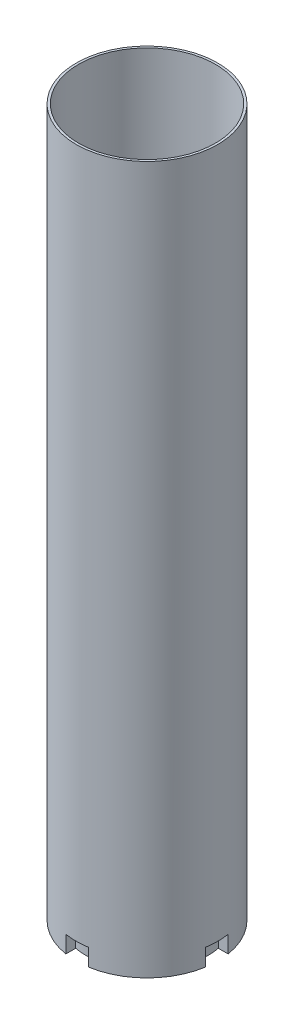
ISO-10303-21;
HEADER;
FILE_DESCRIPTION(('STEP AP214'),'2;1');
FILE_NAME('part.step','',(''),(''),'','','');
FILE_SCHEMA(('AUTOMOTIVE_DESIGN { 1 0 10303 214 1 1 1 1 }'));
ENDSEC;
DATA;
#1=APPLICATION_CONTEXT('core data for automotive mechanical design processes');
#2=APPLICATION_PROTOCOL_DEFINITION('international standard','automotive_design',2000,#1);
#3=PRODUCT_CONTEXT('',#1,'mechanical');
#4=PRODUCT('Part','Part','',(#3));
#5=PRODUCT_RELATED_PRODUCT_CATEGORY('part','',(#4));
#6=PRODUCT_DEFINITION_FORMATION('','',#4);
#7=PRODUCT_DEFINITION_CONTEXT('part definition',#1,'design');
#8=PRODUCT_DEFINITION('design','',#6,#7);
#9=PRODUCT_DEFINITION_SHAPE('','',#8);
#10=(LENGTH_UNIT() NAMED_UNIT(*) SI_UNIT(.MILLI.,.METRE.));
#11=(NAMED_UNIT(*) PLANE_ANGLE_UNIT() SI_UNIT($,.RADIAN.));
#12=(NAMED_UNIT(*) SI_UNIT($,.STERADIAN.) SOLID_ANGLE_UNIT());
#13=UNCERTAINTY_MEASURE_WITH_UNIT(LENGTH_MEASURE(1.E-05),#10,'distance_accuracy_value','');
#14=(GEOMETRIC_REPRESENTATION_CONTEXT(3) GLOBAL_UNCERTAINTY_ASSIGNED_CONTEXT((#13)) GLOBAL_UNIT_ASSIGNED_CONTEXT((#10,
#11,#12)) REPRESENTATION_CONTEXT('',''));
#15=CARTESIAN_POINT('',(0.,0.,0.));
#16=DIRECTION('',(0.,0.,1.));
#17=DIRECTION('',(1.,0.,0.));
#18=AXIS2_PLACEMENT_3D('',#15,#16,#17);
#19=CARTESIAN_POINT('',(0.,310.,0.));
#20=DIRECTION('',(0.,-1.,0.));
#21=DIRECTION('',(0.,0.,-1.));
#22=AXIS2_PLACEMENT_3D('',#19,#20,#21);
#23=CYLINDRICAL_SURFACE('',#22,31.);
#24=CARTESIAN_POINT('',(0.,310.,0.));
#25=DIRECTION('',(0.,1.,0.));
#26=DIRECTION('',(0.,0.,1.));
#27=AXIS2_PLACEMENT_3D('',#24,#25,#26);
#28=CIRCLE('',#27,31.);
#29=CARTESIAN_POINT('',(0.,310.,31.));
#30=VERTEX_POINT('',#29);
#31=EDGE_CURVE('E11',#30,#30,#28,.T.);
#32=ORIENTED_EDGE('',*,*,#31,.F.);
#33=EDGE_LOOP('',(#32));
#34=FACE_BOUND('',#33,.T.);
#35=CARTESIAN_POINT('',(0.,7.5,0.));
#36=DIRECTION('',(0.,-1.,0.));
#37=DIRECTION('',(0.,0.,-1.));
#38=AXIS2_PLACEMENT_3D('',#35,#36,#37);
#39=CIRCLE('',#38,31.);
#40=CARTESIAN_POINT('',(-5.,7.5,-30.5941170815567));
#41=VERTEX_POINT('',#40);
#42=CARTESIAN_POINT('',(5.,7.5,-30.5941170815567));
#43=VERTEX_POINT('',#42);
#44=EDGE_CURVE('E165',#41,#43,#39,.T.);
#45=ORIENTED_EDGE('',*,*,#44,.F.);
#46=DIRECTION('',(0.,-1.,0.));
#47=VECTOR('',#46,1.);
#48=CARTESIAN_POINT('',(-5.,7.5,-30.5941170815567));
#49=LINE('',#48,#47);
#50=CARTESIAN_POINT('',(-5.,0.,-30.5941170815567));
#51=VERTEX_POINT('',#50);
#52=EDGE_CURVE('E314',#41,#51,#49,.T.);
#53=ORIENTED_EDGE('',*,*,#52,.T.);
#54=CARTESIAN_POINT('',(0.,0.,0.));
#55=DIRECTION('',(0.,1.,0.));
#56=DIRECTION('',(0.,0.,1.));
#57=AXIS2_PLACEMENT_3D('',#54,#55,#56);
#58=CIRCLE('',#57,31.);
#59=CARTESIAN_POINT('',(-30.5941170815567,0.,-4.99999999999989));
#60=VERTEX_POINT('',#59);
#61=EDGE_CURVE('E339',#51,#60,#58,.T.);
#62=ORIENTED_EDGE('',*,*,#61,.T.);
#63=DIRECTION('',(0.,-1.,0.));
#64=VECTOR('',#63,1.);
#65=CARTESIAN_POINT('',(-30.5941170815567,7.5,-4.99999999999989));
#66=LINE('',#65,#64);
#67=CARTESIAN_POINT('',(-30.5941170815567,7.5,-4.99999999999989));
#68=VERTEX_POINT('',#67);
#69=EDGE_CURVE('E61',#68,#60,#66,.T.);
#70=ORIENTED_EDGE('',*,*,#69,.F.);
#71=CARTESIAN_POINT('',(0.,7.5,0.));
#72=DIRECTION('',(0.,-1.,0.));
#73=DIRECTION('',(0.,0.,-1.));
#74=AXIS2_PLACEMENT_3D('',#71,#72,#73);
#75=CIRCLE('',#74,31.);
#76=CARTESIAN_POINT('',(-30.5941170815567,7.5,5.00000000000011));
#77=VERTEX_POINT('',#76);
#78=EDGE_CURVE('E190',#77,#68,#75,.T.);
#79=ORIENTED_EDGE('',*,*,#78,.F.);
#80=DIRECTION('',(0.,-1.,0.));
#81=VECTOR('',#80,1.);
#82=CARTESIAN_POINT('',(-30.5941170815567,7.5,5.00000000000011));
#83=LINE('',#82,#81);
#84=CARTESIAN_POINT('',(-30.5941170815567,0.,5.00000000000011));
#85=VERTEX_POINT('',#84);
#86=EDGE_CURVE('E217',#77,#85,#83,.T.);
#87=ORIENTED_EDGE('',*,*,#86,.T.);
#88=CARTESIAN_POINT('',(-4.99999999999979,0.,30.5941170815567));
#89=VERTEX_POINT('',#88);
#90=EDGE_CURVE('E310',#85,#89,#58,.T.);
#91=ORIENTED_EDGE('',*,*,#90,.T.);
#92=DIRECTION('',(0.,-1.,0.));
#93=VECTOR('',#92,1.);
#94=CARTESIAN_POINT('',(-4.99999999999979,7.5,30.5941170815567));
#95=LINE('',#94,#93);
#96=CARTESIAN_POINT('',(-4.99999999999979,7.5,30.5941170815567));
#97=VERTEX_POINT('',#96);
#98=EDGE_CURVE('E53',#97,#89,#95,.T.);
#99=ORIENTED_EDGE('',*,*,#98,.F.);
#100=CARTESIAN_POINT('',(0.,7.5,0.));
#101=DIRECTION('',(0.,-1.,0.));
#102=DIRECTION('',(0.,0.,-1.));
#103=AXIS2_PLACEMENT_3D('',#100,#101,#102);
#104=CIRCLE('',#103,31.);
#105=CARTESIAN_POINT('',(5.00000000000021,7.5,30.5941170815567));
#106=VERTEX_POINT('',#105);
#107=EDGE_CURVE('E230',#106,#97,#104,.T.);
#108=ORIENTED_EDGE('',*,*,#107,.F.);
#109=DIRECTION('',(0.,-1.,0.));
#110=VECTOR('',#109,1.);
#111=CARTESIAN_POINT('',(5.00000000000021,7.5,30.5941170815567));
#112=LINE('',#111,#110);
#113=CARTESIAN_POINT('',(5.00000000000021,0.,30.5941170815567));
#114=VERTEX_POINT('',#113);
#115=EDGE_CURVE('E211',#106,#114,#112,.T.);
#116=ORIENTED_EDGE('',*,*,#115,.T.);
#117=CARTESIAN_POINT('',(30.5941170815568,0.,4.99999999999968));
#118=VERTEX_POINT('',#117);
#119=EDGE_CURVE('E41',#114,#118,#58,.T.);
#120=ORIENTED_EDGE('',*,*,#119,.T.);
#121=DIRECTION('',(0.,-1.,0.));
#122=VECTOR('',#121,1.);
#123=CARTESIAN_POINT('',(30.5941170815568,7.5,4.99999999999968));
#124=LINE('',#123,#122);
#125=CARTESIAN_POINT('',(30.5941170815568,7.5,4.99999999999968));
#126=VERTEX_POINT('',#125);
#127=EDGE_CURVE('E285',#126,#118,#124,.T.);
#128=ORIENTED_EDGE('',*,*,#127,.F.);
#129=CARTESIAN_POINT('',(0.,7.5,0.));
#130=DIRECTION('',(0.,-1.,0.));
#131=DIRECTION('',(0.,0.,-1.));
#132=AXIS2_PLACEMENT_3D('',#129,#130,#131);
#133=CIRCLE('',#132,31.);
#134=CARTESIAN_POINT('',(30.5941170815567,7.5,-5.00000000000032));
#135=VERTEX_POINT('',#134);
#136=EDGE_CURVE('E268',#135,#126,#133,.T.);
#137=ORIENTED_EDGE('',*,*,#136,.F.);
#138=DIRECTION('',(0.,-1.,0.));
#139=VECTOR('',#138,1.);
#140=CARTESIAN_POINT('',(30.5941170815567,7.5,-5.00000000000032));
#141=LINE('',#140,#139);
#142=CARTESIAN_POINT('',(30.5941170815567,0.,-5.00000000000032));
#143=VERTEX_POINT('',#142);
#144=EDGE_CURVE('E251',#135,#143,#141,.T.);
#145=ORIENTED_EDGE('',*,*,#144,.T.);
#146=CARTESIAN_POINT('',(5.,0.,-30.5941170815567));
#147=VERTEX_POINT('',#146);
#148=EDGE_CURVE('E180',#143,#147,#58,.T.);
#149=ORIENTED_EDGE('',*,*,#148,.T.);
#150=DIRECTION('',(0.,-1.,0.));
#151=VECTOR('',#150,1.);
#152=CARTESIAN_POINT('',(5.,7.5,-30.5941170815567));
#153=LINE('',#152,#151);
#154=EDGE_CURVE('E157',#43,#147,#153,.T.);
#155=ORIENTED_EDGE('',*,*,#154,.F.);
#156=EDGE_LOOP('',(#45,#53,#62,#70,#79,#87,#91,#99,#108,#116,#120,#128,#137,#145,#149,#155));
#157=FACE_BOUND('',#156,.T.);
#158=ADVANCED_FACE('F38',(#34,#157),#23,.T.);
#159=CARTESIAN_POINT('',(0.,310.,0.));
#160=DIRECTION('',(0.,1.,0.));
#161=DIRECTION('',(0.,0.,1.));
#162=AXIS2_PLACEMENT_3D('',#159,#160,#161);
#163=PLANE('',#162);
#164=CARTESIAN_POINT('',(0.,310.,0.));
#165=DIRECTION('',(0.,1.,0.));
#166=DIRECTION('',(0.,0.,1.));
#167=AXIS2_PLACEMENT_3D('',#164,#165,#166);
#168=CIRCLE('',#167,30.);
#169=CARTESIAN_POINT('',(0.,310.,30.));
#170=VERTEX_POINT('',#169);
#171=EDGE_CURVE('E311',#170,#170,#168,.T.);
#172=ORIENTED_EDGE('',*,*,#171,.F.);
#173=EDGE_LOOP('',(#172));
#174=FACE_BOUND('',#173,.T.);
#175=ORIENTED_EDGE('',*,*,#31,.T.);
#176=EDGE_LOOP('',(#175));
#177=FACE_BOUND('',#176,.T.);
#178=ADVANCED_FACE('F377',(#174,#177),#163,.T.);
#179=CARTESIAN_POINT('',(0.,0.,0.));
#180=DIRECTION('',(0.,1.,0.));
#181=DIRECTION('',(0.,0.,1.));
#182=AXIS2_PLACEMENT_3D('',#179,#180,#181);
#183=PLANE('',#182);
#184=ORIENTED_EDGE('',*,*,#61,.F.);
#185=DIRECTION('',(0.,0.,-1.));
#186=VECTOR('',#185,1.);
#187=CARTESIAN_POINT('',(-5.,0.,-26.2785558963958));
#188=LINE('',#187,#186);
#189=CARTESIAN_POINT('',(-5.,0.,-26.2785558963958));
#190=VERTEX_POINT('',#189);
#191=EDGE_CURVE('E175',#190,#51,#188,.T.);
#192=ORIENTED_EDGE('',*,*,#191,.F.);
#193=CARTESIAN_POINT('',(0.,0.,0.));
#194=DIRECTION('',(0.,1.,0.));
#195=DIRECTION('',(0.,0.,-1.));
#196=AXIS2_PLACEMENT_3D('',#193,#194,#195);
#197=CIRCLE('',#196,26.75);
#198=CARTESIAN_POINT('',(4.99999999999999,0.,-26.2785558963958));
#199=VERTEX_POINT('',#198);
#200=EDGE_CURVE('E325',#199,#190,#197,.T.);
#201=ORIENTED_EDGE('',*,*,#200,.F.);
#202=DIRECTION('',(0.,0.,1.));
#203=VECTOR('',#202,1.);
#204=CARTESIAN_POINT('',(5.,0.,-26.2785558963958));
#205=LINE('',#204,#203);
#206=EDGE_CURVE('E221',#147,#199,#205,.T.);
#207=ORIENTED_EDGE('',*,*,#206,.F.);
#208=ORIENTED_EDGE('',*,*,#148,.F.);
#209=DIRECTION('',(1.,0.,0.));
#210=VECTOR('',#209,1.);
#211=CARTESIAN_POINT('',(26.2785558963958,0.,-5.00000000000028));
#212=LINE('',#211,#210);
#213=CARTESIAN_POINT('',(26.2785558963958,0.,-5.00000000000028));
#214=VERTEX_POINT('',#213);
#215=EDGE_CURVE('E273',#214,#143,#212,.T.);
#216=ORIENTED_EDGE('',*,*,#215,.F.);
#217=CARTESIAN_POINT('',(0.,0.,0.));
#218=DIRECTION('',(0.,1.,0.));
#219=DIRECTION('',(0.,0.,-1.));
#220=AXIS2_PLACEMENT_3D('',#217,#218,#219);
#221=CIRCLE('',#220,26.75);
#222=CARTESIAN_POINT('',(26.2785558963959,0.,4.99999999999973));
#223=VERTEX_POINT('',#222);
#224=EDGE_CURVE('E290',#223,#214,#221,.T.);
#225=ORIENTED_EDGE('',*,*,#224,.F.);
#226=DIRECTION('',(-1.,0.,0.));
#227=VECTOR('',#226,1.);
#228=CARTESIAN_POINT('',(26.2785558963959,0.,4.99999999999973));
#229=LINE('',#228,#227);
#230=EDGE_CURVE('E286',#118,#223,#229,.T.);
#231=ORIENTED_EDGE('',*,*,#230,.F.);
#232=ORIENTED_EDGE('',*,*,#119,.F.);
#233=DIRECTION('',(0.,0.,1.));
#234=VECTOR('',#233,1.);
#235=CARTESIAN_POINT('',(5.00000000000018,0.,26.2785558963958));
#236=LINE('',#235,#234);
#237=CARTESIAN_POINT('',(5.00000000000018,0.,26.2785558963958));
#238=VERTEX_POINT('',#237);
#239=EDGE_CURVE('E235',#238,#114,#236,.T.);
#240=ORIENTED_EDGE('',*,*,#239,.F.);
#241=CARTESIAN_POINT('',(0.,0.,0.));
#242=DIRECTION('',(0.,1.,0.));
#243=DIRECTION('',(0.,0.,-1.));
#244=AXIS2_PLACEMENT_3D('',#241,#242,#243);
#245=CIRCLE('',#244,26.75);
#246=CARTESIAN_POINT('',(-4.99999999999981,0.,26.2785558963959));
#247=VERTEX_POINT('',#246);
#248=EDGE_CURVE('E250',#247,#238,#245,.T.);
#249=ORIENTED_EDGE('',*,*,#248,.F.);
#250=DIRECTION('',(0.,0.,-1.));
#251=VECTOR('',#250,1.);
#252=CARTESIAN_POINT('',(-4.99999999999982,0.,26.2785558963959));
#253=LINE('',#252,#251);
#254=EDGE_CURVE('E247',#89,#247,#253,.T.);
#255=ORIENTED_EDGE('',*,*,#254,.F.);
#256=ORIENTED_EDGE('',*,*,#90,.F.);
#257=DIRECTION('',(-1.,0.,0.));
#258=VECTOR('',#257,1.);
#259=CARTESIAN_POINT('',(-26.2785558963958,0.,5.00000000000009));
#260=LINE('',#259,#258);
#261=CARTESIAN_POINT('',(-26.2785558963958,0.,5.00000000000009));
#262=VERTEX_POINT('',#261);
#263=EDGE_CURVE('E195',#262,#85,#260,.T.);
#264=ORIENTED_EDGE('',*,*,#263,.F.);
#265=CARTESIAN_POINT('',(0.,0.,0.));
#266=DIRECTION('',(0.,1.,0.));
#267=DIRECTION('',(0.,0.,-1.));
#268=AXIS2_PLACEMENT_3D('',#265,#266,#267);
#269=CIRCLE('',#268,26.75);
#270=CARTESIAN_POINT('',(-26.2785558963958,0.,-4.99999999999989));
#271=VERTEX_POINT('',#270);
#272=EDGE_CURVE('E210',#271,#262,#269,.T.);
#273=ORIENTED_EDGE('',*,*,#272,.F.);
#274=DIRECTION('',(1.,0.,0.));
#275=VECTOR('',#274,1.);
#276=CARTESIAN_POINT('',(-26.2785558963958,0.,-4.99999999999991));
#277=LINE('',#276,#275);
#278=EDGE_CURVE('E207',#60,#271,#277,.T.);
#279=ORIENTED_EDGE('',*,*,#278,.F.);
#280=EDGE_LOOP('',(#184,#192,#201,#207,#208,#216,#225,#231,#232,#240,#249,#255,#256,#264,#273,#279));
#281=FACE_BOUND('',#280,.T.);
#282=ADVANCED_FACE('F338',(#281),#183,.F.);
#283=CARTESIAN_POINT('',(0.,10.,0.));
#284=DIRECTION('',(0.,1.,0.));
#285=DIRECTION('',(0.,0.,1.));
#286=AXIS2_PLACEMENT_3D('',#283,#284,#285);
#287=CYLINDRICAL_SURFACE('',#286,30.);
#288=CARTESIAN_POINT('',(0.,10.,0.));
#289=DIRECTION('',(0.,1.,0.));
#290=DIRECTION('',(0.,0.,1.));
#291=AXIS2_PLACEMENT_3D('',#288,#289,#290);
#292=CIRCLE('',#291,30.);
#293=CARTESIAN_POINT('',(0.,10.,30.));
#294=VERTEX_POINT('',#293);
#295=EDGE_CURVE('E306',#294,#294,#292,.T.);
#296=ORIENTED_EDGE('',*,*,#295,.F.);
#297=EDGE_LOOP('',(#296));
#298=FACE_BOUND('',#297,.T.);
#299=ORIENTED_EDGE('',*,*,#171,.T.);
#300=EDGE_LOOP('',(#299));
#301=FACE_BOUND('',#300,.T.);
#302=ADVANCED_FACE('F389',(#298,#301),#287,.F.);
#303=CARTESIAN_POINT('',(0.,10.,0.));
#304=DIRECTION('',(0.,1.,0.));
#305=DIRECTION('',(0.,0.,1.));
#306=AXIS2_PLACEMENT_3D('',#303,#304,#305);
#307=PLANE('',#306);
#308=ORIENTED_EDGE('',*,*,#295,.T.);
#309=EDGE_LOOP('',(#308));
#310=FACE_BOUND('',#309,.T.);
#311=ADVANCED_FACE('F374',(#310),#307,.T.);
#312=CARTESIAN_POINT('',(26.2785558963958,7.5,-5.00000000000028));
#313=DIRECTION('',(0.,0.,-1.));
#314=DIRECTION('',(-1.,0.,0.));
#315=AXIS2_PLACEMENT_3D('',#312,#313,#314);
#316=PLANE('',#315);
#317=ORIENTED_EDGE('',*,*,#215,.T.);
#318=ORIENTED_EDGE('',*,*,#144,.F.);
#319=DIRECTION('',(1.,0.,0.));
#320=VECTOR('',#319,1.);
#321=CARTESIAN_POINT('',(26.2785558963958,7.5,-5.00000000000028));
#322=LINE('',#321,#320);
#323=CARTESIAN_POINT('',(26.2785558963958,7.5,-5.00000000000028));
#324=VERTEX_POINT('',#323);
#325=EDGE_CURVE('E281',#324,#135,#322,.T.);
#326=ORIENTED_EDGE('',*,*,#325,.F.);
#327=DIRECTION('',(0.,-1.,0.));
#328=VECTOR('',#327,1.);
#329=CARTESIAN_POINT('',(26.2785558963958,7.5,-5.00000000000028));
#330=LINE('',#329,#328);
#331=EDGE_CURVE('E298',#324,#214,#330,.T.);
#332=ORIENTED_EDGE('',*,*,#331,.T.);
#333=EDGE_LOOP('',(#317,#318,#326,#332));
#334=FACE_BOUND('',#333,.T.);
#335=ADVANCED_FACE('F364',(#334),#316,.F.);
#336=CARTESIAN_POINT('',(0.,7.5,0.));
#337=DIRECTION('',(0.,-1.,0.));
#338=DIRECTION('',(0.,0.,-1.));
#339=AXIS2_PLACEMENT_3D('',#336,#337,#338);
#340=CYLINDRICAL_SURFACE('',#339,26.75);
#341=ORIENTED_EDGE('',*,*,#224,.T.);
#342=ORIENTED_EDGE('',*,*,#331,.F.);
#343=CARTESIAN_POINT('',(0.,7.5,0.));
#344=DIRECTION('',(0.,1.,0.));
#345=DIRECTION('',(0.,0.,-1.));
#346=AXIS2_PLACEMENT_3D('',#343,#344,#345);
#347=CIRCLE('',#346,26.75);
#348=CARTESIAN_POINT('',(26.2785558963959,7.5,4.99999999999973));
#349=VERTEX_POINT('',#348);
#350=EDGE_CURVE('E277',#349,#324,#347,.T.);
#351=ORIENTED_EDGE('',*,*,#350,.F.);
#352=DIRECTION('',(0.,-1.,0.));
#353=VECTOR('',#352,1.);
#354=CARTESIAN_POINT('',(26.2785558963959,7.5,4.99999999999973));
#355=LINE('',#354,#353);
#356=EDGE_CURVE('E301',#349,#223,#355,.T.);
#357=ORIENTED_EDGE('',*,*,#356,.T.);
#358=EDGE_LOOP('',(#341,#342,#351,#357));
#359=FACE_BOUND('',#358,.T.);
#360=ADVANCED_FACE('F366',(#359),#340,.T.);
#361=CARTESIAN_POINT('',(26.2785558963959,7.5,4.99999999999973));
#362=DIRECTION('',(0.,0.,1.));
#363=DIRECTION('',(1.,0.,0.));
#364=AXIS2_PLACEMENT_3D('',#361,#362,#363);
#365=PLANE('',#364);
#366=ORIENTED_EDGE('',*,*,#230,.T.);
#367=ORIENTED_EDGE('',*,*,#356,.F.);
#368=DIRECTION('',(-1.,0.,0.));
#369=VECTOR('',#368,1.);
#370=CARTESIAN_POINT('',(26.2785558963959,7.5,4.99999999999973));
#371=LINE('',#370,#369);
#372=EDGE_CURVE('E272',#126,#349,#371,.T.);
#373=ORIENTED_EDGE('',*,*,#372,.F.);
#374=ORIENTED_EDGE('',*,*,#127,.T.);
#375=EDGE_LOOP('',(#366,#367,#373,#374));
#376=FACE_BOUND('',#375,.T.);
#377=ADVANCED_FACE('F358',(#376),#365,.F.);
#378=CARTESIAN_POINT('',(0.,7.5,0.));
#379=DIRECTION('',(0.,-1.,0.));
#380=DIRECTION('',(0.,0.,-1.));
#381=AXIS2_PLACEMENT_3D('',#378,#379,#380);
#382=PLANE('',#381);
#383=ORIENTED_EDGE('',*,*,#136,.T.);
#384=ORIENTED_EDGE('',*,*,#372,.T.);
#385=ORIENTED_EDGE('',*,*,#350,.T.);
#386=ORIENTED_EDGE('',*,*,#325,.T.);
#387=EDGE_LOOP('',(#383,#384,#385,#386));
#388=FACE_BOUND('',#387,.T.);
#389=ADVANCED_FACE('F361',(#388),#382,.T.);
#390=CARTESIAN_POINT('',(5.00000000000018,7.5,26.2785558963958));
#391=DIRECTION('',(1.,0.,0.));
#392=DIRECTION('',(0.,0.,-1.));
#393=AXIS2_PLACEMENT_3D('',#390,#391,#392);
#394=PLANE('',#393);
#395=ORIENTED_EDGE('',*,*,#239,.T.);
#396=ORIENTED_EDGE('',*,*,#115,.F.);
#397=DIRECTION('',(0.,0.,1.));
#398=VECTOR('',#397,1.);
#399=CARTESIAN_POINT('',(5.00000000000018,7.5,26.2785558963958));
#400=LINE('',#399,#398);
#401=CARTESIAN_POINT('',(5.00000000000018,7.5,26.2785558963958));
#402=VERTEX_POINT('',#401);
#403=EDGE_CURVE('E243',#402,#106,#400,.T.);
#404=ORIENTED_EDGE('',*,*,#403,.F.);
#405=DIRECTION('',(0.,-1.,0.));
#406=VECTOR('',#405,1.);
#407=CARTESIAN_POINT('',(5.00000000000018,7.5,26.2785558963958));
#408=LINE('',#407,#406);
#409=EDGE_CURVE('E260',#402,#238,#408,.T.);
#410=ORIENTED_EDGE('',*,*,#409,.T.);
#411=EDGE_LOOP('',(#395,#396,#404,#410));
#412=FACE_BOUND('',#411,.T.);
#413=ADVANCED_FACE('F427',(#412),#394,.F.);
#414=CARTESIAN_POINT('',(0.,7.5,0.));
#415=DIRECTION('',(0.,-1.,0.));
#416=DIRECTION('',(0.,0.,-1.));
#417=AXIS2_PLACEMENT_3D('',#414,#415,#416);
#418=CYLINDRICAL_SURFACE('',#417,26.75);
#419=ORIENTED_EDGE('',*,*,#248,.T.);
#420=ORIENTED_EDGE('',*,*,#409,.F.);
#421=CARTESIAN_POINT('',(0.,7.5,0.));
#422=DIRECTION('',(0.,1.,0.));
#423=DIRECTION('',(0.,0.,-1.));
#424=AXIS2_PLACEMENT_3D('',#421,#422,#423);
#425=CIRCLE('',#424,26.75);
#426=CARTESIAN_POINT('',(-4.99999999999981,7.5,26.2785558963959));
#427=VERTEX_POINT('',#426);
#428=EDGE_CURVE('E239',#427,#402,#425,.T.);
#429=ORIENTED_EDGE('',*,*,#428,.F.);
#430=DIRECTION('',(0.,-1.,0.));
#431=VECTOR('',#430,1.);
#432=CARTESIAN_POINT('',(-4.99999999999981,7.5,26.2785558963959));
#433=LINE('',#432,#431);
#434=EDGE_CURVE('E263',#427,#247,#433,.T.);
#435=ORIENTED_EDGE('',*,*,#434,.T.);
#436=EDGE_LOOP('',(#419,#420,#429,#435));
#437=FACE_BOUND('',#436,.T.);
#438=ADVANCED_FACE('F436',(#437),#418,.T.);
#439=CARTESIAN_POINT('',(-4.99999999999982,7.5,26.2785558963959));
#440=DIRECTION('',(-1.,0.,0.));
#441=DIRECTION('',(0.,0.,1.));
#442=AXIS2_PLACEMENT_3D('',#439,#440,#441);
#443=PLANE('',#442);
#444=ORIENTED_EDGE('',*,*,#254,.T.);
#445=ORIENTED_EDGE('',*,*,#434,.F.);
#446=DIRECTION('',(0.,0.,-1.));
#447=VECTOR('',#446,1.);
#448=CARTESIAN_POINT('',(-4.99999999999982,7.5,26.2785558963959));
#449=LINE('',#448,#447);
#450=EDGE_CURVE('E234',#97,#427,#449,.T.);
#451=ORIENTED_EDGE('',*,*,#450,.F.);
#452=ORIENTED_EDGE('',*,*,#98,.T.);
#453=EDGE_LOOP('',(#444,#445,#451,#452));
#454=FACE_BOUND('',#453,.T.);
#455=ADVANCED_FACE('F446',(#454),#443,.F.);
#456=CARTESIAN_POINT('',(0.,7.5,0.));
#457=DIRECTION('',(0.,-1.,0.));
#458=DIRECTION('',(0.,0.,-1.));
#459=AXIS2_PLACEMENT_3D('',#456,#457,#458);
#460=PLANE('',#459);
#461=ORIENTED_EDGE('',*,*,#107,.T.);
#462=ORIENTED_EDGE('',*,*,#450,.T.);
#463=ORIENTED_EDGE('',*,*,#428,.T.);
#464=ORIENTED_EDGE('',*,*,#403,.T.);
#465=EDGE_LOOP('',(#461,#462,#463,#464));
#466=FACE_BOUND('',#465,.T.);
#467=ADVANCED_FACE('F456',(#466),#460,.T.);
#468=CARTESIAN_POINT('',(-26.2785558963958,7.5,5.00000000000009));
#469=DIRECTION('',(0.,0.,1.));
#470=DIRECTION('',(1.,0.,0.));
#471=AXIS2_PLACEMENT_3D('',#468,#469,#470);
#472=PLANE('',#471);
#473=ORIENTED_EDGE('',*,*,#263,.T.);
#474=ORIENTED_EDGE('',*,*,#86,.F.);
#475=DIRECTION('',(-1.,0.,0.));
#476=VECTOR('',#475,1.);
#477=CARTESIAN_POINT('',(-26.2785558963958,7.5,5.00000000000009));
#478=LINE('',#477,#476);
#479=CARTESIAN_POINT('',(-26.2785558963958,7.5,5.00000000000009));
#480=VERTEX_POINT('',#479);
#481=EDGE_CURVE('E203',#480,#77,#478,.T.);
#482=ORIENTED_EDGE('',*,*,#481,.F.);
#483=DIRECTION('',(0.,-1.,0.));
#484=VECTOR('',#483,1.);
#485=CARTESIAN_POINT('',(-26.2785558963958,7.5,5.00000000000009));
#486=LINE('',#485,#484);
#487=EDGE_CURVE('E222',#480,#262,#486,.T.);
#488=ORIENTED_EDGE('',*,*,#487,.T.);
#489=EDGE_LOOP('',(#473,#474,#482,#488));
#490=FACE_BOUND('',#489,.T.);
#491=ADVANCED_FACE('F465',(#490),#472,.F.);
#492=CARTESIAN_POINT('',(0.,7.5,0.));
#493=DIRECTION('',(0.,-1.,0.));
#494=DIRECTION('',(0.,0.,-1.));
#495=AXIS2_PLACEMENT_3D('',#492,#493,#494);
#496=CYLINDRICAL_SURFACE('',#495,26.75);
#497=ORIENTED_EDGE('',*,*,#272,.T.);
#498=ORIENTED_EDGE('',*,*,#487,.F.);
#499=CARTESIAN_POINT('',(0.,7.5,0.));
#500=DIRECTION('',(0.,1.,0.));
#501=DIRECTION('',(0.,0.,-1.));
#502=AXIS2_PLACEMENT_3D('',#499,#500,#501);
#503=CIRCLE('',#502,26.75);
#504=CARTESIAN_POINT('',(-26.2785558963958,7.5,-4.99999999999989));
#505=VERTEX_POINT('',#504);
#506=EDGE_CURVE('E199',#505,#480,#503,.T.);
#507=ORIENTED_EDGE('',*,*,#506,.F.);
#508=DIRECTION('',(0.,-1.,0.));
#509=VECTOR('',#508,1.);
#510=CARTESIAN_POINT('',(-26.2785558963958,7.5,-4.99999999999989));
#511=LINE('',#510,#509);
#512=EDGE_CURVE('E225',#505,#271,#511,.T.);
#513=ORIENTED_EDGE('',*,*,#512,.T.);
#514=EDGE_LOOP('',(#497,#498,#507,#513));
#515=FACE_BOUND('',#514,.T.);
#516=ADVANCED_FACE('F475',(#515),#496,.T.);
#517=CARTESIAN_POINT('',(-26.2785558963958,7.5,-4.99999999999991));
#518=DIRECTION('',(0.,0.,-1.));
#519=DIRECTION('',(-1.,0.,0.));
#520=AXIS2_PLACEMENT_3D('',#517,#518,#519);
#521=PLANE('',#520);
#522=ORIENTED_EDGE('',*,*,#278,.T.);
#523=ORIENTED_EDGE('',*,*,#512,.F.);
#524=DIRECTION('',(1.,0.,0.));
#525=VECTOR('',#524,1.);
#526=CARTESIAN_POINT('',(-26.2785558963958,7.5,-4.99999999999991));
#527=LINE('',#526,#525);
#528=EDGE_CURVE('E194',#68,#505,#527,.T.);
#529=ORIENTED_EDGE('',*,*,#528,.F.);
#530=ORIENTED_EDGE('',*,*,#69,.T.);
#531=EDGE_LOOP('',(#522,#523,#529,#530));
#532=FACE_BOUND('',#531,.T.);
#533=ADVANCED_FACE('F485',(#532),#521,.F.);
#534=CARTESIAN_POINT('',(0.,7.5,0.));
#535=DIRECTION('',(0.,-1.,0.));
#536=DIRECTION('',(0.,0.,-1.));
#537=AXIS2_PLACEMENT_3D('',#534,#535,#536);
#538=PLANE('',#537);
#539=ORIENTED_EDGE('',*,*,#78,.T.);
#540=ORIENTED_EDGE('',*,*,#528,.T.);
#541=ORIENTED_EDGE('',*,*,#506,.T.);
#542=ORIENTED_EDGE('',*,*,#481,.T.);
#543=EDGE_LOOP('',(#539,#540,#541,#542));
#544=FACE_BOUND('',#543,.T.);
#545=ADVANCED_FACE('F495',(#544),#538,.T.);
#546=CARTESIAN_POINT('',(-5.,7.5,-26.2785558963958));
#547=DIRECTION('',(-1.,0.,0.));
#548=DIRECTION('',(0.,0.,1.));
#549=AXIS2_PLACEMENT_3D('',#546,#547,#548);
#550=PLANE('',#549);
#551=ORIENTED_EDGE('',*,*,#191,.T.);
#552=ORIENTED_EDGE('',*,*,#52,.F.);
#553=DIRECTION('',(0.,0.,-1.));
#554=VECTOR('',#553,1.);
#555=CARTESIAN_POINT('',(-5.,7.5,-26.2785558963958));
#556=LINE('',#555,#554);
#557=CARTESIAN_POINT('',(-5.,7.5,-26.2785558963958));
#558=VERTEX_POINT('',#557);
#559=EDGE_CURVE('E171',#558,#41,#556,.T.);
#560=ORIENTED_EDGE('',*,*,#559,.F.);
#561=DIRECTION('',(0.,-1.,0.));
#562=VECTOR('',#561,1.);
#563=CARTESIAN_POINT('',(-5.,7.5,-26.2785558963958));
#564=LINE('',#563,#562);
#565=EDGE_CURVE('E185',#558,#190,#564,.T.);
#566=ORIENTED_EDGE('',*,*,#565,.T.);
#567=EDGE_LOOP('',(#551,#552,#560,#566));
#568=FACE_BOUND('',#567,.T.);
#569=ADVANCED_FACE('F334',(#568),#550,.F.);
#570=CARTESIAN_POINT('',(0.,7.5,0.));
#571=DIRECTION('',(0.,-1.,0.));
#572=DIRECTION('',(0.,0.,-1.));
#573=AXIS2_PLACEMENT_3D('',#570,#571,#572);
#574=CYLINDRICAL_SURFACE('',#573,26.75);
#575=ORIENTED_EDGE('',*,*,#200,.T.);
#576=ORIENTED_EDGE('',*,*,#565,.F.);
#577=CARTESIAN_POINT('',(0.,7.5,0.));
#578=DIRECTION('',(0.,1.,0.));
#579=DIRECTION('',(0.,0.,-1.));
#580=AXIS2_PLACEMENT_3D('',#577,#578,#579);
#581=CIRCLE('',#580,26.75);
#582=CARTESIAN_POINT('',(4.99999999999999,7.5,-26.2785558963958));
#583=VERTEX_POINT('',#582);
#584=EDGE_CURVE('E164',#583,#558,#581,.T.);
#585=ORIENTED_EDGE('',*,*,#584,.F.);
#586=DIRECTION('',(0.,-1.,0.));
#587=VECTOR('',#586,1.);
#588=CARTESIAN_POINT('',(4.99999999999999,7.5,-26.2785558963958));
#589=LINE('',#588,#587);
#590=EDGE_CURVE('E159',#583,#199,#589,.T.);
#591=ORIENTED_EDGE('',*,*,#590,.T.);
#592=EDGE_LOOP('',(#575,#576,#585,#591));
#593=FACE_BOUND('',#592,.T.);
#594=ADVANCED_FACE('F513',(#593),#574,.T.);
#595=CARTESIAN_POINT('',(5.,7.5,-26.2785558963958));
#596=DIRECTION('',(1.,0.,0.));
#597=DIRECTION('',(0.,0.,-1.));
#598=AXIS2_PLACEMENT_3D('',#595,#596,#597);
#599=PLANE('',#598);
#600=ORIENTED_EDGE('',*,*,#206,.T.);
#601=ORIENTED_EDGE('',*,*,#590,.F.);
#602=DIRECTION('',(0.,0.,1.));
#603=VECTOR('',#602,1.);
#604=CARTESIAN_POINT('',(5.,7.5,-26.2785558963958));
#605=LINE('',#604,#603);
#606=EDGE_CURVE('E152',#43,#583,#605,.T.);
#607=ORIENTED_EDGE('',*,*,#606,.F.);
#608=ORIENTED_EDGE('',*,*,#154,.T.);
#609=EDGE_LOOP('',(#600,#601,#607,#608));
#610=FACE_BOUND('',#609,.T.);
#611=ADVANCED_FACE('F155',(#610),#599,.F.);
#612=CARTESIAN_POINT('',(0.,7.5,0.));
#613=DIRECTION('',(0.,-1.,0.));
#614=DIRECTION('',(0.,0.,-1.));
#615=AXIS2_PLACEMENT_3D('',#612,#613,#614);
#616=PLANE('',#615);
#617=ORIENTED_EDGE('',*,*,#44,.T.);
#618=ORIENTED_EDGE('',*,*,#606,.T.);
#619=ORIENTED_EDGE('',*,*,#584,.T.);
#620=ORIENTED_EDGE('',*,*,#559,.T.);
#621=EDGE_LOOP('',(#617,#618,#619,#620));
#622=FACE_BOUND('',#621,.T.);
#623=ADVANCED_FACE('F169',(#622),#616,.T.);
#624=CLOSED_SHELL('',(#158,#178,#282,#302,#311,#335,#360,#377,#389,#413,#438,#455,#467,#491,
#516,#533,#545,#569,#594,#611,#623));
#625=MANIFOLD_SOLID_BREP('B2',#624);
#626=ADVANCED_BREP_SHAPE_REPRESENTATION('',(#18,#625),#14);
#627=SHAPE_DEFINITION_REPRESENTATION(#9,#626);
ENDSEC;
END-ISO-10303-21;
